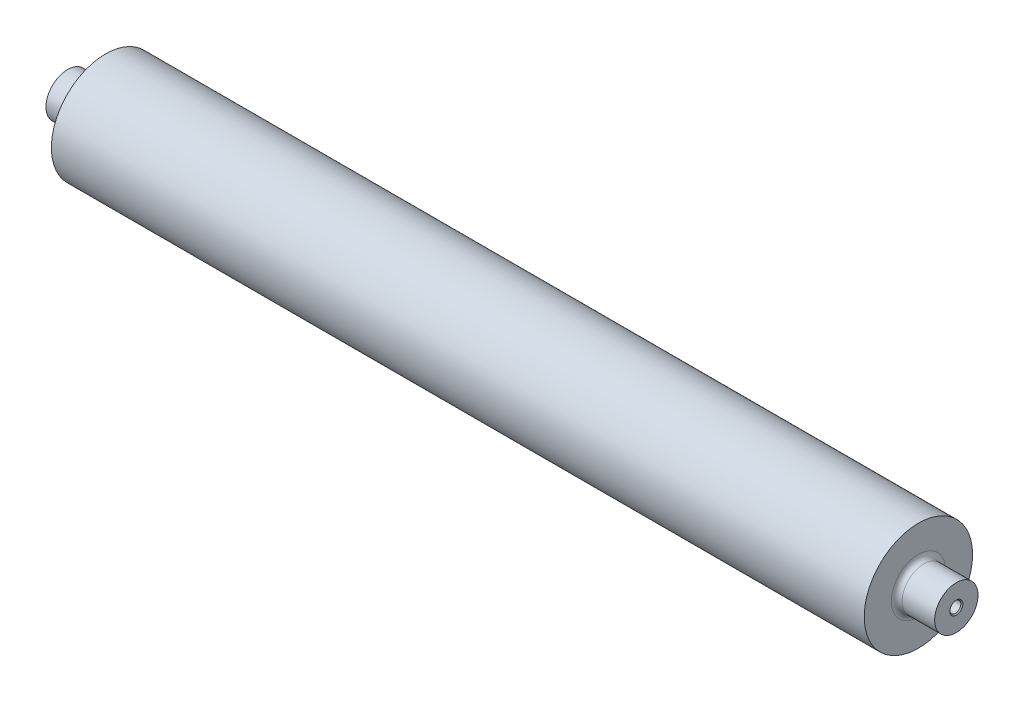
ISO-10303-21;
HEADER;
FILE_DESCRIPTION(('STEP AP214'),'2;1');
FILE_NAME('part.step','',(''),(''),'','','');
FILE_SCHEMA(('AUTOMOTIVE_DESIGN { 1 0 10303 214 1 1 1 1 }'));
ENDSEC;
DATA;
#1=APPLICATION_CONTEXT('core data for automotive mechanical design processes');
#2=APPLICATION_PROTOCOL_DEFINITION('international standard','automotive_design',2000,#1);
#3=PRODUCT_CONTEXT('',#1,'mechanical');
#4=PRODUCT('Part','Part','',(#3));
#5=PRODUCT_RELATED_PRODUCT_CATEGORY('part','',(#4));
#6=PRODUCT_DEFINITION_FORMATION('','',#4);
#7=PRODUCT_DEFINITION_CONTEXT('part definition',#1,'design');
#8=PRODUCT_DEFINITION('design','',#6,#7);
#9=PRODUCT_DEFINITION_SHAPE('','',#8);
#10=(LENGTH_UNIT() NAMED_UNIT(*) SI_UNIT(.MILLI.,.METRE.));
#11=(NAMED_UNIT(*) PLANE_ANGLE_UNIT() SI_UNIT($,.RADIAN.));
#12=(NAMED_UNIT(*) SI_UNIT($,.STERADIAN.) SOLID_ANGLE_UNIT());
#13=UNCERTAINTY_MEASURE_WITH_UNIT(LENGTH_MEASURE(1.E-05),#10,'distance_accuracy_value','');
#14=(GEOMETRIC_REPRESENTATION_CONTEXT(3) GLOBAL_UNCERTAINTY_ASSIGNED_CONTEXT((#13)) GLOBAL_UNIT_ASSIGNED_CONTEXT((#10,
#11,#12)) REPRESENTATION_CONTEXT('',''));
#15=CARTESIAN_POINT('',(0.,0.,0.));
#16=DIRECTION('',(0.,0.,1.));
#17=DIRECTION('',(1.,0.,0.));
#18=AXIS2_PLACEMENT_3D('',#15,#16,#17);
#19=CARTESIAN_POINT('',(0.,0.,0.));
#20=DIRECTION('',(-1.,0.,0.));
#21=DIRECTION('',(0.,0.,1.));
#22=AXIS2_PLACEMENT_3D('',#19,#20,#21);
#23=PLANE('',#22);
#24=CARTESIAN_POINT('',(0.,0.,0.));
#25=DIRECTION('',(-1.,0.,0.));
#26=DIRECTION('',(0.,0.,1.));
#27=AXIS2_PLACEMENT_3D('',#24,#25,#26);
#28=CIRCLE('',#27,6.025);
#29=CARTESIAN_POINT('',(0.,0.,6.025));
#30=VERTEX_POINT('',#29);
#31=EDGE_CURVE('E69',#30,#30,#28,.T.);
#32=ORIENTED_EDGE('',*,*,#31,.F.);
#33=EDGE_LOOP('',(#32));
#34=FACE_BOUND('',#33,.T.);
#35=CARTESIAN_POINT('',(0.,0.,0.));
#36=DIRECTION('',(1.,0.,0.));
#37=DIRECTION('',(0.,0.,-1.));
#38=AXIS2_PLACEMENT_3D('',#35,#36,#37);
#39=CIRCLE('',#38,20.);
#40=CARTESIAN_POINT('',(0.,0.,-20.));
#41=VERTEX_POINT('',#40);
#42=EDGE_CURVE('E87',#41,#41,#39,.T.);
#43=ORIENTED_EDGE('',*,*,#42,.F.);
#44=EDGE_LOOP('',(#43));
#45=FACE_BOUND('',#44,.T.);
#46=ADVANCED_FACE('F38',(#34,#45),#23,.T.);
#47=CARTESIAN_POINT('',(820.,0.,0.));
#48=DIRECTION('',(1.,0.,0.));
#49=DIRECTION('',(0.,0.,-1.));
#50=AXIS2_PLACEMENT_3D('',#47,#48,#49);
#51=CYLINDRICAL_SURFACE('',#50,20.);
#52=CARTESIAN_POINT('',(30.,0.,0.));
#53=DIRECTION('',(-1.,0.,0.));
#54=DIRECTION('',(0.,0.,1.));
#55=AXIS2_PLACEMENT_3D('',#52,#53,#54);
#56=CIRCLE('',#55,20.);
#57=CARTESIAN_POINT('',(30.,0.,20.));
#58=VERTEX_POINT('',#57);
#59=EDGE_CURVE('E11',#58,#58,#56,.T.);
#60=ORIENTED_EDGE('',*,*,#59,.T.);
#61=EDGE_LOOP('',(#60));
#62=FACE_BOUND('',#61,.T.);
#63=ORIENTED_EDGE('',*,*,#42,.T.);
#64=EDGE_LOOP('',(#63));
#65=FACE_BOUND('',#64,.T.);
#66=ADVANCED_FACE('F115',(#62,#65),#51,.T.);
#67=CARTESIAN_POINT('',(35.,20.,0.));
#68=DIRECTION('',(-1.,0.,0.));
#69=DIRECTION('',(0.,0.,1.));
#70=AXIS2_PLACEMENT_3D('',#67,#68,#69);
#71=PLANE('',#70);
#72=CARTESIAN_POINT('',(35.,0.,0.));
#73=DIRECTION('',(-1.,0.,0.));
#74=DIRECTION('',(0.,0.,1.));
#75=AXIS2_PLACEMENT_3D('',#72,#73,#74);
#76=CIRCLE('',#75,25.);
#77=CARTESIAN_POINT('',(35.,0.,25.));
#78=VERTEX_POINT('',#77);
#79=EDGE_CURVE('E46',#78,#78,#76,.F.);
#80=ORIENTED_EDGE('',*,*,#79,.T.);
#81=EDGE_LOOP('',(#80));
#82=FACE_BOUND('',#81,.T.);
#83=CARTESIAN_POINT('',(35.,0.,0.));
#84=DIRECTION('',(1.,0.,0.));
#85=DIRECTION('',(0.,0.,-1.));
#86=AXIS2_PLACEMENT_3D('',#83,#84,#85);
#87=CIRCLE('',#86,49.9999999999999);
#88=CARTESIAN_POINT('',(35.,0.,-49.9999999999999));
#89=VERTEX_POINT('',#88);
#90=EDGE_CURVE('E84',#89,#89,#87,.T.);
#91=ORIENTED_EDGE('',*,*,#90,.F.);
#92=EDGE_LOOP('',(#91));
#93=FACE_BOUND('',#92,.T.);
#94=ADVANCED_FACE('F98',(#82,#93),#71,.T.);
#95=CARTESIAN_POINT('',(820.,0.,0.));
#96=DIRECTION('',(1.,0.,0.));
#97=DIRECTION('',(0.,0.,-1.));
#98=AXIS2_PLACEMENT_3D('',#95,#96,#97);
#99=CYLINDRICAL_SURFACE('',#98,49.9999999999999);
#100=ORIENTED_EDGE('',*,*,#90,.T.);
#101=EDGE_LOOP('',(#100));
#102=FACE_BOUND('',#101,.T.);
#103=CARTESIAN_POINT('',(785.,0.,0.));
#104=DIRECTION('',(1.,0.,0.));
#105=DIRECTION('',(0.,0.,-1.));
#106=AXIS2_PLACEMENT_3D('',#103,#104,#105);
#107=CIRCLE('',#106,49.9999999999999);
#108=CARTESIAN_POINT('',(785.,0.,-49.9999999999999));
#109=VERTEX_POINT('',#108);
#110=EDGE_CURVE('E81',#109,#109,#107,.T.);
#111=ORIENTED_EDGE('',*,*,#110,.F.);
#112=EDGE_LOOP('',(#111));
#113=FACE_BOUND('',#112,.T.);
#114=ADVANCED_FACE('F128',(#102,#113),#99,.T.);
#115=CARTESIAN_POINT('',(785.,49.9999999999999,0.));
#116=DIRECTION('',(1.,0.,0.));
#117=DIRECTION('',(0.,0.,-1.));
#118=AXIS2_PLACEMENT_3D('',#115,#116,#117);
#119=PLANE('',#118);
#120=CARTESIAN_POINT('',(785.,0.,0.));
#121=DIRECTION('',(1.,0.,0.));
#122=DIRECTION('',(0.,0.,-1.));
#123=AXIS2_PLACEMENT_3D('',#120,#121,#122);
#124=CIRCLE('',#123,25.);
#125=CARTESIAN_POINT('',(785.,0.,-25.));
#126=VERTEX_POINT('',#125);
#127=EDGE_CURVE('E93',#126,#126,#124,.F.);
#128=ORIENTED_EDGE('',*,*,#127,.T.);
#129=EDGE_LOOP('',(#128));
#130=FACE_BOUND('',#129,.T.);
#131=ORIENTED_EDGE('',*,*,#110,.T.);
#132=EDGE_LOOP('',(#131));
#133=FACE_BOUND('',#132,.T.);
#134=ADVANCED_FACE('F131',(#130,#133),#119,.T.);
#135=CARTESIAN_POINT('',(820.,0.,0.));
#136=DIRECTION('',(1.,0.,0.));
#137=DIRECTION('',(0.,0.,-1.));
#138=AXIS2_PLACEMENT_3D('',#135,#136,#137);
#139=CYLINDRICAL_SURFACE('',#138,20.);
#140=CARTESIAN_POINT('',(790.,0.,0.));
#141=DIRECTION('',(1.,0.,0.));
#142=DIRECTION('',(0.,0.,-1.));
#143=AXIS2_PLACEMENT_3D('',#140,#141,#142);
#144=CIRCLE('',#143,20.);
#145=CARTESIAN_POINT('',(790.,0.,-20.));
#146=VERTEX_POINT('',#145);
#147=EDGE_CURVE('E90',#146,#146,#144,.T.);
#148=ORIENTED_EDGE('',*,*,#147,.T.);
#149=EDGE_LOOP('',(#148));
#150=FACE_BOUND('',#149,.T.);
#151=CARTESIAN_POINT('',(820.,0.,0.));
#152=DIRECTION('',(1.,0.,0.));
#153=DIRECTION('',(0.,0.,-1.));
#154=AXIS2_PLACEMENT_3D('',#151,#152,#153);
#155=CIRCLE('',#154,20.);
#156=CARTESIAN_POINT('',(820.,0.,-20.));
#157=VERTEX_POINT('',#156);
#158=EDGE_CURVE('E78',#157,#157,#155,.T.);
#159=ORIENTED_EDGE('',*,*,#158,.F.);
#160=EDGE_LOOP('',(#159));
#161=FACE_BOUND('',#160,.T.);
#162=ADVANCED_FACE('F135',(#150,#161),#139,.T.);
#163=CARTESIAN_POINT('',(820.,20.,0.));
#164=DIRECTION('',(1.,0.,0.));
#165=DIRECTION('',(0.,0.,-1.));
#166=AXIS2_PLACEMENT_3D('',#163,#164,#165);
#167=PLANE('',#166);
#168=CARTESIAN_POINT('',(820.,0.,0.));
#169=DIRECTION('',(1.,0.,0.));
#170=DIRECTION('',(0.,0.,-1.));
#171=AXIS2_PLACEMENT_3D('',#168,#169,#170);
#172=CIRCLE('',#171,6.025);
#173=CARTESIAN_POINT('',(820.,0.,-6.025));
#174=VERTEX_POINT('',#173);
#175=EDGE_CURVE('E62',#174,#174,#172,.T.);
#176=ORIENTED_EDGE('',*,*,#175,.F.);
#177=EDGE_LOOP('',(#176));
#178=FACE_BOUND('',#177,.T.);
#179=ORIENTED_EDGE('',*,*,#158,.T.);
#180=EDGE_LOOP('',(#179));
#181=FACE_BOUND('',#180,.T.);
#182=ADVANCED_FACE('F111',(#178,#181),#167,.T.);
#183=CARTESIAN_POINT('',(790.,0.,0.));
#184=DIRECTION('',(1.,0.,0.));
#185=DIRECTION('',(0.,0.,-1.));
#186=AXIS2_PLACEMENT_3D('',#183,#184,#185);
#187=TOROIDAL_SURFACE('',#186,25.,5.);
#188=ORIENTED_EDGE('',*,*,#127,.F.);
#189=EDGE_LOOP('',(#188));
#190=FACE_BOUND('',#189,.T.);
#191=ORIENTED_EDGE('',*,*,#147,.F.);
#192=EDGE_LOOP('',(#191));
#193=FACE_BOUND('',#192,.T.);
#194=ADVANCED_FACE('F103',(#190,#193),#187,.F.);
#195=CARTESIAN_POINT('',(30.,0.,0.));
#196=DIRECTION('',(-1.,0.,0.));
#197=DIRECTION('',(0.,0.,1.));
#198=AXIS2_PLACEMENT_3D('',#195,#196,#197);
#199=TOROIDAL_SURFACE('',#198,25.,5.);
#200=ORIENTED_EDGE('',*,*,#59,.F.);
#201=EDGE_LOOP('',(#200));
#202=FACE_BOUND('',#201,.T.);
#203=ORIENTED_EDGE('',*,*,#79,.F.);
#204=EDGE_LOOP('',(#203));
#205=FACE_BOUND('',#204,.T.);
#206=ADVANCED_FACE('F40',(#202,#205),#199,.F.);
#207=CARTESIAN_POINT('',(790.75,0.,0.));
#208=DIRECTION('',(1.,0.,0.));
#209=DIRECTION('',(0.,0.,-1.));
#210=AXIS2_PLACEMENT_3D('',#207,#208,#209);
#211=CONICAL_SURFACE('',#210,5.09999999999998,1.02974425867665);
#212=CARTESIAN_POINT('',(787.685610842959,0.,0.));
#213=VERTEX_POINT('',#212);
#214=VERTEX_LOOP('',#213);
#215=FACE_BOUND('',#214,.T.);
#216=CARTESIAN_POINT('',(790.75,0.,0.));
#217=DIRECTION('',(1.,0.,0.));
#218=DIRECTION('',(0.,0.,-1.));
#219=AXIS2_PLACEMENT_3D('',#216,#217,#218);
#220=CIRCLE('',#219,5.09999999999998);
#221=CARTESIAN_POINT('',(790.75,0.,-5.09999999999998));
#222=VERTEX_POINT('',#221);
#223=EDGE_CURVE('E75',#222,#222,#220,.T.);
#224=ORIENTED_EDGE('',*,*,#223,.T.);
#225=EDGE_LOOP('',(#224));
#226=FACE_BOUND('',#225,.T.);
#227=ADVANCED_FACE('F102',(#215,#226),#211,.F.);
#228=CARTESIAN_POINT('',(820.,0.,0.));
#229=DIRECTION('',(1.,0.,0.));
#230=DIRECTION('',(0.,0.,-1.));
#231=AXIS2_PLACEMENT_3D('',#228,#229,#230);
#232=CYLINDRICAL_SURFACE('',#231,5.09999999999999);
#233=ORIENTED_EDGE('',*,*,#223,.F.);
#234=EDGE_LOOP('',(#233));
#235=FACE_BOUND('',#234,.T.);
#236=CARTESIAN_POINT('',(819.075,0.,0.));
#237=DIRECTION('',(1.,0.,0.));
#238=DIRECTION('',(0.,0.,-1.));
#239=AXIS2_PLACEMENT_3D('',#236,#237,#238);
#240=CIRCLE('',#239,5.09999999999999);
#241=CARTESIAN_POINT('',(819.075,0.,-5.09999999999999));
#242=VERTEX_POINT('',#241);
#243=EDGE_CURVE('E66',#242,#242,#240,.T.);
#244=ORIENTED_EDGE('',*,*,#243,.T.);
#245=EDGE_LOOP('',(#244));
#246=FACE_BOUND('',#245,.T.);
#247=ADVANCED_FACE('F109',(#235,#246),#232,.F.);
#248=CARTESIAN_POINT('',(820.,0.,0.));
#249=DIRECTION('',(1.,0.,0.));
#250=DIRECTION('',(0.,0.,-1.));
#251=AXIS2_PLACEMENT_3D('',#248,#249,#250);
#252=CONICAL_SURFACE('',#251,6.025,0.785398163397421);
#253=ORIENTED_EDGE('',*,*,#243,.F.);
#254=EDGE_LOOP('',(#253));
#255=FACE_BOUND('',#254,.T.);
#256=ORIENTED_EDGE('',*,*,#175,.T.);
#257=EDGE_LOOP('',(#256));
#258=FACE_BOUND('',#257,.T.);
#259=ADVANCED_FACE('F56',(#255,#258),#252,.F.);
#260=CARTESIAN_POINT('',(29.25,0.,0.));
#261=DIRECTION('',(-1.,0.,0.));
#262=DIRECTION('',(0.,0.,1.));
#263=AXIS2_PLACEMENT_3D('',#260,#261,#262);
#264=CONICAL_SURFACE('',#263,5.09999999999998,1.02974425867665);
#265=CARTESIAN_POINT('',(32.3143891570406,0.,0.));
#266=VERTEX_POINT('',#265);
#267=VERTEX_LOOP('',#266);
#268=FACE_BOUND('',#267,.T.);
#269=CARTESIAN_POINT('',(29.25,0.,0.));
#270=DIRECTION('',(-1.,0.,0.));
#271=DIRECTION('',(0.,0.,1.));
#272=AXIS2_PLACEMENT_3D('',#269,#270,#271);
#273=CIRCLE('',#272,5.09999999999998);
#274=CARTESIAN_POINT('',(29.25,0.,5.09999999999998));
#275=VERTEX_POINT('',#274);
#276=EDGE_CURVE('E60',#275,#275,#273,.T.);
#277=ORIENTED_EDGE('',*,*,#276,.T.);
#278=EDGE_LOOP('',(#277));
#279=FACE_BOUND('',#278,.T.);
#280=ADVANCED_FACE('F52',(#268,#279),#264,.F.);
#281=CARTESIAN_POINT('',(0.,0.,0.));
#282=DIRECTION('',(-1.,0.,0.));
#283=DIRECTION('',(0.,0.,1.));
#284=AXIS2_PLACEMENT_3D('',#281,#282,#283);
#285=CYLINDRICAL_SURFACE('',#284,5.09999999999999);
#286=ORIENTED_EDGE('',*,*,#276,.F.);
#287=EDGE_LOOP('',(#286));
#288=FACE_BOUND('',#287,.T.);
#289=CARTESIAN_POINT('',(0.925000000000023,0.,0.));
#290=DIRECTION('',(-1.,0.,0.));
#291=DIRECTION('',(0.,0.,1.));
#292=AXIS2_PLACEMENT_3D('',#289,#290,#291);
#293=CIRCLE('',#292,5.09999999999999);
#294=CARTESIAN_POINT('',(0.925000000000023,0.,5.09999999999999));
#295=VERTEX_POINT('',#294);
#296=EDGE_CURVE('E63',#295,#295,#293,.T.);
#297=ORIENTED_EDGE('',*,*,#296,.T.);
#298=EDGE_LOOP('',(#297));
#299=FACE_BOUND('',#298,.T.);
#300=ADVANCED_FACE('F55',(#288,#299),#285,.F.);
#301=CARTESIAN_POINT('',(0.,0.,0.));
#302=DIRECTION('',(-1.,0.,0.));
#303=DIRECTION('',(0.,0.,1.));
#304=AXIS2_PLACEMENT_3D('',#301,#302,#303);
#305=CONICAL_SURFACE('',#304,6.025,0.785398163397443);
#306=ORIENTED_EDGE('',*,*,#296,.F.);
#307=EDGE_LOOP('',(#306));
#308=FACE_BOUND('',#307,.T.);
#309=ORIENTED_EDGE('',*,*,#31,.T.);
#310=EDGE_LOOP('',(#309));
#311=FACE_BOUND('',#310,.T.);
#312=ADVANCED_FACE('F151',(#308,#311),#305,.F.);
#313=CLOSED_SHELL('',(#46,#66,#94,#114,#134,#162,#182,#194,#206,#227,#247,#259,#280,#300,#312));
#314=MANIFOLD_SOLID_BREP('B2',#313);
#315=ADVANCED_BREP_SHAPE_REPRESENTATION('',(#18,#314),#14);
#316=SHAPE_DEFINITION_REPRESENTATION(#9,#315);
ENDSEC;
END-ISO-10303-21;
